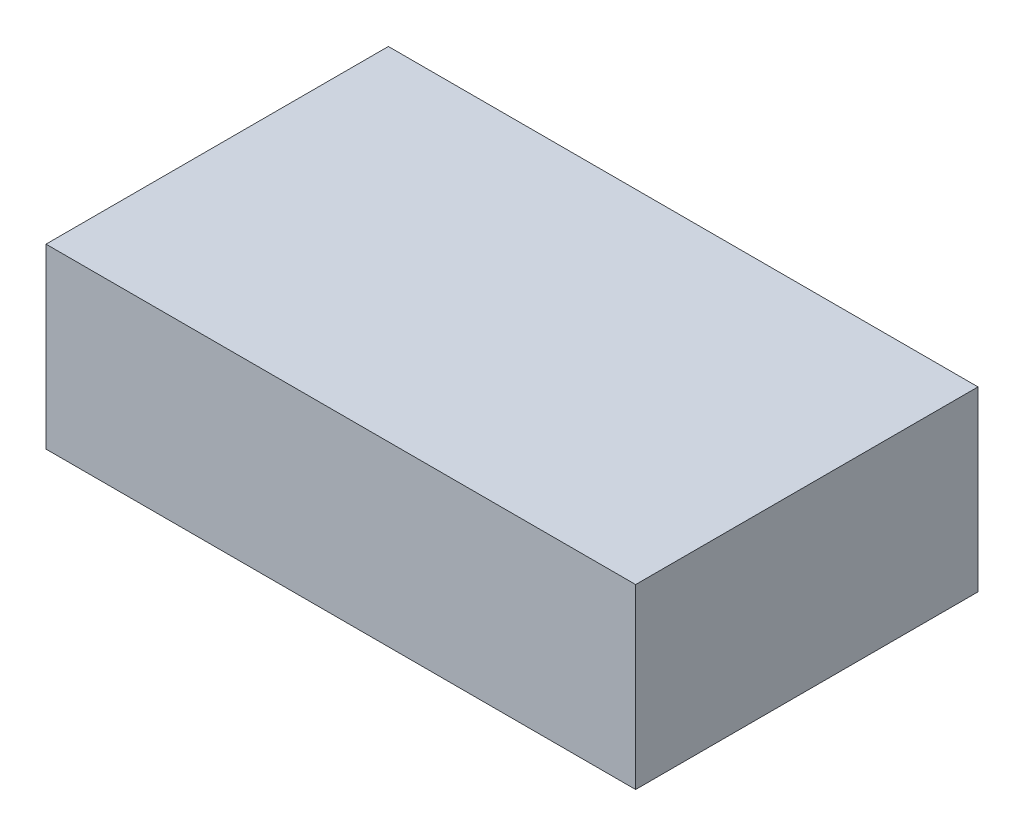
ISO-10303-21;
HEADER;
FILE_DESCRIPTION(('STEP AP214'),'2;1');
FILE_NAME('part.step','',(''),(''),'','','');
FILE_SCHEMA(('AUTOMOTIVE_DESIGN { 1 0 10303 214 1 1 1 1 }'));
ENDSEC;
DATA;
#1=APPLICATION_CONTEXT('core data for automotive mechanical design processes');
#2=APPLICATION_PROTOCOL_DEFINITION('international standard','automotive_design',2000,#1);
#3=PRODUCT_CONTEXT('',#1,'mechanical');
#4=PRODUCT('Part','Part','',(#3));
#5=PRODUCT_RELATED_PRODUCT_CATEGORY('part','',(#4));
#6=PRODUCT_DEFINITION_FORMATION('','',#4);
#7=PRODUCT_DEFINITION_CONTEXT('part definition',#1,'design');
#8=PRODUCT_DEFINITION('design','',#6,#7);
#9=PRODUCT_DEFINITION_SHAPE('','',#8);
#10=(LENGTH_UNIT() NAMED_UNIT(*) SI_UNIT(.MILLI.,.METRE.));
#11=(NAMED_UNIT(*) PLANE_ANGLE_UNIT() SI_UNIT($,.RADIAN.));
#12=(NAMED_UNIT(*) SI_UNIT($,.STERADIAN.) SOLID_ANGLE_UNIT());
#13=UNCERTAINTY_MEASURE_WITH_UNIT(LENGTH_MEASURE(1.E-05),#10,'distance_accuracy_value','');
#14=(GEOMETRIC_REPRESENTATION_CONTEXT(3) GLOBAL_UNCERTAINTY_ASSIGNED_CONTEXT((#13)) GLOBAL_UNIT_ASSIGNED_CONTEXT((#10,
#11,#12)) REPRESENTATION_CONTEXT('',''));
#15=CARTESIAN_POINT('',(0.,0.,0.));
#16=DIRECTION('',(0.,0.,1.));
#17=DIRECTION('',(1.,0.,0.));
#18=AXIS2_PLACEMENT_3D('',#15,#16,#17);
#19=CARTESIAN_POINT('',(0.,14.,0.));
#20=DIRECTION('',(1.,0.,0.));
#21=DIRECTION('',(0.,0.,-1.));
#22=AXIS2_PLACEMENT_3D('',#19,#20,#21);
#23=PLANE('',#22);
#24=DIRECTION('',(0.,0.,1.));
#25=VECTOR('',#24,1.);
#26=CARTESIAN_POINT('',(0.,0.,0.));
#27=LINE('',#26,#25);
#28=CARTESIAN_POINT('',(0.,0.,-27.));
#29=VERTEX_POINT('',#28);
#30=CARTESIAN_POINT('',(0.,0.,0.));
#31=VERTEX_POINT('',#30);
#32=EDGE_CURVE('E103',#29,#31,#27,.T.);
#33=ORIENTED_EDGE('',*,*,#32,.T.);
#34=DIRECTION('',(0.,-1.,0.));
#35=VECTOR('',#34,1.);
#36=CARTESIAN_POINT('',(0.,14.,0.));
#37=LINE('',#36,#35);
#38=CARTESIAN_POINT('',(0.,14.,0.));
#39=VERTEX_POINT('',#38);
#40=EDGE_CURVE('E11',#39,#31,#37,.T.);
#41=ORIENTED_EDGE('',*,*,#40,.F.);
#42=DIRECTION('',(0.,0.,1.));
#43=VECTOR('',#42,1.);
#44=CARTESIAN_POINT('',(0.,14.,0.));
#45=LINE('',#44,#43);
#46=CARTESIAN_POINT('',(0.,14.,-27.));
#47=VERTEX_POINT('',#46);
#48=EDGE_CURVE('E91',#47,#39,#45,.T.);
#49=ORIENTED_EDGE('',*,*,#48,.F.);
#50=DIRECTION('',(0.,-1.,0.));
#51=VECTOR('',#50,1.);
#52=CARTESIAN_POINT('',(0.,14.,-27.));
#53=LINE('',#52,#51);
#54=EDGE_CURVE('E99',#47,#29,#53,.T.);
#55=ORIENTED_EDGE('',*,*,#54,.T.);
#56=EDGE_LOOP('',(#33,#41,#49,#55));
#57=FACE_BOUND('',#56,.T.);
#58=ADVANCED_FACE('F40',(#57),#23,.F.);
#59=CARTESIAN_POINT('',(0.,14.,0.));
#60=DIRECTION('',(0.,0.,-1.));
#61=DIRECTION('',(-1.,0.,0.));
#62=AXIS2_PLACEMENT_3D('',#59,#60,#61);
#63=PLANE('',#62);
#64=DIRECTION('',(1.,0.,0.));
#65=VECTOR('',#64,1.);
#66=CARTESIAN_POINT('',(0.,0.,0.));
#67=LINE('',#66,#65);
#68=CARTESIAN_POINT('',(46.5,0.,0.));
#69=VERTEX_POINT('',#68);
#70=EDGE_CURVE('E95',#31,#69,#67,.T.);
#71=ORIENTED_EDGE('',*,*,#70,.T.);
#72=DIRECTION('',(0.,-1.,0.));
#73=VECTOR('',#72,1.);
#74=CARTESIAN_POINT('',(46.5,14.,0.));
#75=LINE('',#74,#73);
#76=CARTESIAN_POINT('',(46.5,14.,0.));
#77=VERTEX_POINT('',#76);
#78=EDGE_CURVE('E48',#77,#69,#75,.T.);
#79=ORIENTED_EDGE('',*,*,#78,.F.);
#80=DIRECTION('',(1.,0.,0.));
#81=VECTOR('',#80,1.);
#82=CARTESIAN_POINT('',(0.,14.,0.));
#83=LINE('',#82,#81);
#84=EDGE_CURVE('E86',#39,#77,#83,.T.);
#85=ORIENTED_EDGE('',*,*,#84,.F.);
#86=ORIENTED_EDGE('',*,*,#40,.T.);
#87=EDGE_LOOP('',(#71,#79,#85,#86));
#88=FACE_BOUND('',#87,.T.);
#89=ADVANCED_FACE('F94',(#88),#63,.F.);
#90=CARTESIAN_POINT('',(46.5,14.,0.));
#91=DIRECTION('',(-1.,0.,0.));
#92=DIRECTION('',(0.,0.,1.));
#93=AXIS2_PLACEMENT_3D('',#90,#91,#92);
#94=PLANE('',#93);
#95=DIRECTION('',(0.,0.,-1.));
#96=VECTOR('',#95,1.);
#97=CARTESIAN_POINT('',(46.5,0.,0.));
#98=LINE('',#97,#96);
#99=CARTESIAN_POINT('',(46.5,0.,-27.));
#100=VERTEX_POINT('',#99);
#101=EDGE_CURVE('E73',#69,#100,#98,.T.);
#102=ORIENTED_EDGE('',*,*,#101,.T.);
#103=DIRECTION('',(0.,-1.,0.));
#104=VECTOR('',#103,1.);
#105=CARTESIAN_POINT('',(46.5,14.,-27.));
#106=LINE('',#105,#104);
#107=CARTESIAN_POINT('',(46.5,14.,-27.));
#108=VERTEX_POINT('',#107);
#109=EDGE_CURVE('E96',#108,#100,#106,.T.);
#110=ORIENTED_EDGE('',*,*,#109,.F.);
#111=DIRECTION('',(0.,0.,-1.));
#112=VECTOR('',#111,1.);
#113=CARTESIAN_POINT('',(46.5,14.,0.));
#114=LINE('',#113,#112);
#115=EDGE_CURVE('E89',#77,#108,#114,.T.);
#116=ORIENTED_EDGE('',*,*,#115,.F.);
#117=ORIENTED_EDGE('',*,*,#78,.T.);
#118=EDGE_LOOP('',(#102,#110,#116,#117));
#119=FACE_BOUND('',#118,.T.);
#120=ADVANCED_FACE('F97',(#119),#94,.F.);
#121=CARTESIAN_POINT('',(0.,14.,-27.));
#122=DIRECTION('',(0.,0.,1.));
#123=DIRECTION('',(1.,0.,0.));
#124=AXIS2_PLACEMENT_3D('',#121,#122,#123);
#125=PLANE('',#124);
#126=DIRECTION('',(-1.,0.,0.));
#127=VECTOR('',#126,1.);
#128=CARTESIAN_POINT('',(0.,0.,-27.));
#129=LINE('',#128,#127);
#130=EDGE_CURVE('E79',#100,#29,#129,.T.);
#131=ORIENTED_EDGE('',*,*,#130,.T.);
#132=ORIENTED_EDGE('',*,*,#54,.F.);
#133=DIRECTION('',(-1.,0.,0.));
#134=VECTOR('',#133,1.);
#135=CARTESIAN_POINT('',(0.,14.,-27.));
#136=LINE('',#135,#134);
#137=EDGE_CURVE('E56',#108,#47,#136,.T.);
#138=ORIENTED_EDGE('',*,*,#137,.F.);
#139=ORIENTED_EDGE('',*,*,#109,.T.);
#140=EDGE_LOOP('',(#131,#132,#138,#139));
#141=FACE_BOUND('',#140,.T.);
#142=ADVANCED_FACE('F110',(#141),#125,.F.);
#143=CARTESIAN_POINT('',(0.,14.,0.));
#144=DIRECTION('',(0.,-1.,0.));
#145=DIRECTION('',(0.,0.,-1.));
#146=AXIS2_PLACEMENT_3D('',#143,#144,#145);
#147=PLANE('',#146);
#148=ORIENTED_EDGE('',*,*,#48,.T.);
#149=ORIENTED_EDGE('',*,*,#84,.T.);
#150=ORIENTED_EDGE('',*,*,#115,.T.);
#151=ORIENTED_EDGE('',*,*,#137,.T.);
#152=EDGE_LOOP('',(#148,#149,#150,#151));
#153=FACE_BOUND('',#152,.T.);
#154=ADVANCED_FACE('F87',(#153),#147,.F.);
#155=CARTESIAN_POINT('',(0.,0.,0.));
#156=DIRECTION('',(0.,-1.,0.));
#157=DIRECTION('',(0.,0.,-1.));
#158=AXIS2_PLACEMENT_3D('',#155,#156,#157);
#159=PLANE('',#158);
#160=ORIENTED_EDGE('',*,*,#32,.F.);
#161=ORIENTED_EDGE('',*,*,#130,.F.);
#162=ORIENTED_EDGE('',*,*,#101,.F.);
#163=ORIENTED_EDGE('',*,*,#70,.F.);
#164=EDGE_LOOP('',(#160,#161,#162,#163));
#165=FACE_BOUND('',#164,.T.);
#166=ADVANCED_FACE('F113',(#165),#159,.T.);
#167=CLOSED_SHELL('',(#58,#89,#120,#142,#154,#166));
#168=MANIFOLD_SOLID_BREP('B2',#167);
#169=ADVANCED_BREP_SHAPE_REPRESENTATION('',(#18,#168),#14);
#170=SHAPE_DEFINITION_REPRESENTATION(#9,#169);
ENDSEC;
END-ISO-10303-21;
